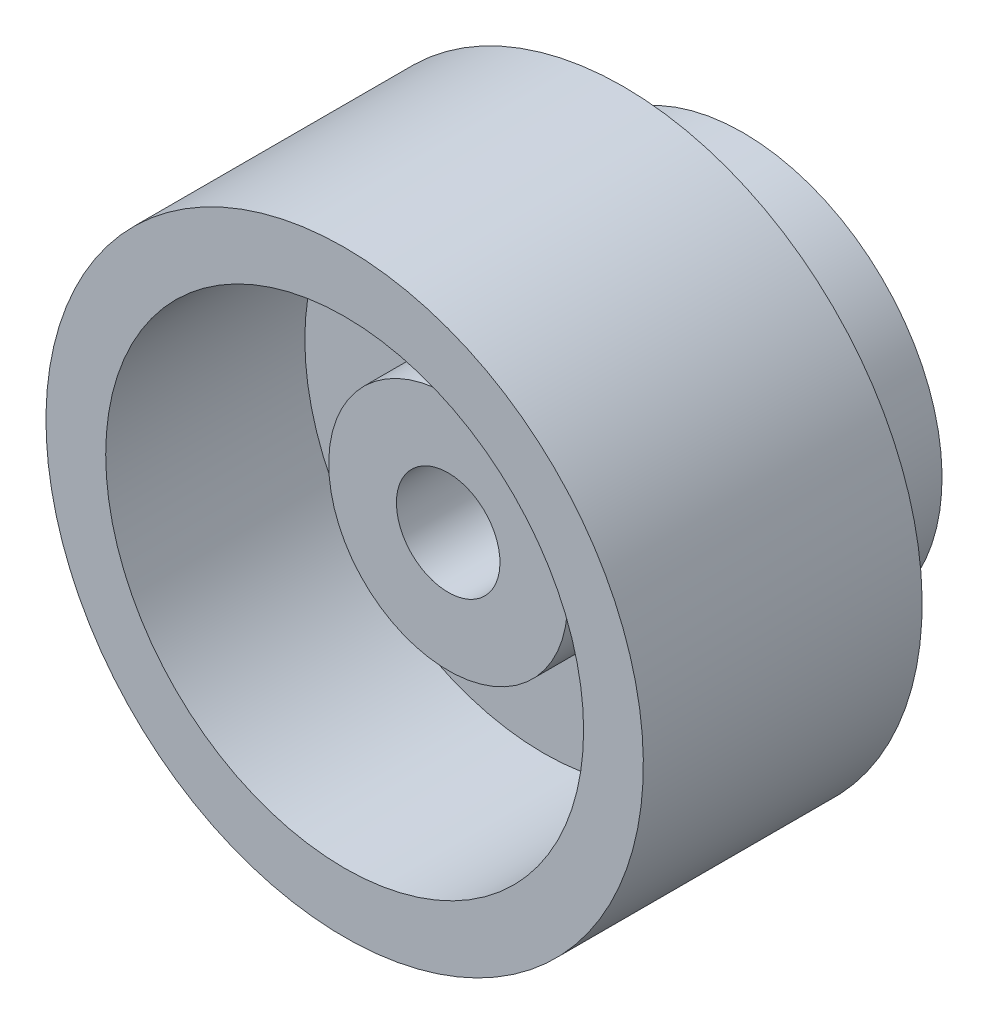
ISO-10303-21;
HEADER;
FILE_DESCRIPTION(('STEP AP214'),'2;1');
FILE_NAME('part.step','',(''),(''),'','','');
FILE_SCHEMA(('AUTOMOTIVE_DESIGN { 1 0 10303 214 1 1 1 1 }'));
ENDSEC;
DATA;
#1=APPLICATION_CONTEXT('core data for automotive mechanical design processes');
#2=APPLICATION_PROTOCOL_DEFINITION('international standard','automotive_design',2000,#1);
#3=PRODUCT_CONTEXT('',#1,'mechanical');
#4=PRODUCT('Part','Part','',(#3));
#5=PRODUCT_RELATED_PRODUCT_CATEGORY('part','',(#4));
#6=PRODUCT_DEFINITION_FORMATION('','',#4);
#7=PRODUCT_DEFINITION_CONTEXT('part definition',#1,'design');
#8=PRODUCT_DEFINITION('design','',#6,#7);
#9=PRODUCT_DEFINITION_SHAPE('','',#8);
#10=(LENGTH_UNIT() NAMED_UNIT(*) SI_UNIT(.MILLI.,.METRE.));
#11=(NAMED_UNIT(*) PLANE_ANGLE_UNIT() SI_UNIT($,.RADIAN.));
#12=(NAMED_UNIT(*) SI_UNIT($,.STERADIAN.) SOLID_ANGLE_UNIT());
#13=UNCERTAINTY_MEASURE_WITH_UNIT(LENGTH_MEASURE(1.E-05),#10,'distance_accuracy_value','');
#14=(GEOMETRIC_REPRESENTATION_CONTEXT(3) GLOBAL_UNCERTAINTY_ASSIGNED_CONTEXT((#13)) GLOBAL_UNIT_ASSIGNED_CONTEXT((#10,
#11,#12)) REPRESENTATION_CONTEXT('',''));
#15=CARTESIAN_POINT('',(0.,0.,0.));
#16=DIRECTION('',(0.,0.,1.));
#17=DIRECTION('',(1.,0.,0.));
#18=AXIS2_PLACEMENT_3D('',#15,#16,#17);
#19=CARTESIAN_POINT('',(0.,0.,-25.));
#20=DIRECTION('',(0.,0.,-1.));
#21=DIRECTION('',(0.,1.,0.));
#22=AXIS2_PLACEMENT_3D('',#19,#20,#21);
#23=CYLINDRICAL_SURFACE('',#22,6.49999999999999);
#24=CARTESIAN_POINT('',(0.,0.,-25.));
#25=DIRECTION('',(0.,0.,-1.));
#26=DIRECTION('',(0.,1.,0.));
#27=AXIS2_PLACEMENT_3D('',#24,#25,#26);
#28=CIRCLE('',#27,6.49999999999999);
#29=CARTESIAN_POINT('',(0.,6.5,-25.));
#30=VERTEX_POINT('',#29);
#31=EDGE_CURVE('E65',#30,#30,#28,.T.);
#32=ORIENTED_EDGE('',*,*,#31,.T.);
#33=EDGE_LOOP('',(#32));
#34=FACE_BOUND('',#33,.T.);
#35=CARTESIAN_POINT('',(0.,0.,12.));
#36=DIRECTION('',(0.,0.,-1.));
#37=DIRECTION('',(0.,1.,0.));
#38=AXIS2_PLACEMENT_3D('',#35,#36,#37);
#39=CIRCLE('',#38,6.5);
#40=CARTESIAN_POINT('',(0.,6.5,12.));
#41=VERTEX_POINT('',#40);
#42=EDGE_CURVE('E10',#41,#41,#39,.T.);
#43=ORIENTED_EDGE('',*,*,#42,.F.);
#44=EDGE_LOOP('',(#43));
#45=FACE_BOUND('',#44,.T.);
#46=ADVANCED_FACE('F31',(#34,#45),#23,.F.);
#47=CARTESIAN_POINT('',(0.,6.5,12.));
#48=DIRECTION('',(0.,0.,1.));
#49=DIRECTION('',(0.,-1.,0.));
#50=AXIS2_PLACEMENT_3D('',#47,#48,#49);
#51=PLANE('',#50);
#52=ORIENTED_EDGE('',*,*,#42,.T.);
#53=EDGE_LOOP('',(#52));
#54=FACE_BOUND('',#53,.T.);
#55=CARTESIAN_POINT('',(0.,0.,12.));
#56=DIRECTION('',(0.,0.,-1.));
#57=DIRECTION('',(0.,1.,0.));
#58=AXIS2_PLACEMENT_3D('',#55,#56,#57);
#59=CIRCLE('',#58,15.);
#60=CARTESIAN_POINT('',(0.,15.,12.));
#61=VERTEX_POINT('',#60);
#62=EDGE_CURVE('E37',#61,#61,#59,.T.);
#63=ORIENTED_EDGE('',*,*,#62,.F.);
#64=EDGE_LOOP('',(#63));
#65=FACE_BOUND('',#64,.T.);
#66=ADVANCED_FACE('F83',(#54,#65),#51,.T.);
#67=CARTESIAN_POINT('',(0.,0.,-25.));
#68=DIRECTION('',(0.,0.,-1.));
#69=DIRECTION('',(0.,1.,0.));
#70=AXIS2_PLACEMENT_3D('',#67,#68,#69);
#71=CYLINDRICAL_SURFACE('',#70,15.);
#72=ORIENTED_EDGE('',*,*,#62,.T.);
#73=EDGE_LOOP('',(#72));
#74=FACE_BOUND('',#73,.T.);
#75=CARTESIAN_POINT('',(0.,0.,0.));
#76=DIRECTION('',(0.,0.,-1.));
#77=DIRECTION('',(0.,1.,0.));
#78=AXIS2_PLACEMENT_3D('',#75,#76,#77);
#79=CIRCLE('',#78,15.);
#80=CARTESIAN_POINT('',(0.,15.,0.));
#81=VERTEX_POINT('',#80);
#82=EDGE_CURVE('E41',#81,#81,#79,.T.);
#83=ORIENTED_EDGE('',*,*,#82,.F.);
#84=EDGE_LOOP('',(#83));
#85=FACE_BOUND('',#84,.T.);
#86=ADVANCED_FACE('F87',(#74,#85),#71,.T.);
#87=CARTESIAN_POINT('',(0.,15.,0.));
#88=DIRECTION('',(0.,0.,1.));
#89=DIRECTION('',(0.,-1.,0.));
#90=AXIS2_PLACEMENT_3D('',#87,#88,#89);
#91=PLANE('',#90);
#92=ORIENTED_EDGE('',*,*,#82,.T.);
#93=EDGE_LOOP('',(#92));
#94=FACE_BOUND('',#93,.T.);
#95=CARTESIAN_POINT('',(0.,0.,0.));
#96=DIRECTION('',(0.,0.,-1.));
#97=DIRECTION('',(0.,1.,0.));
#98=AXIS2_PLACEMENT_3D('',#95,#96,#97);
#99=CIRCLE('',#98,30.);
#100=CARTESIAN_POINT('',(0.,30.,0.));
#101=VERTEX_POINT('',#100);
#102=EDGE_CURVE('E45',#101,#101,#99,.T.);
#103=ORIENTED_EDGE('',*,*,#102,.F.);
#104=EDGE_LOOP('',(#103));
#105=FACE_BOUND('',#104,.T.);
#106=ADVANCED_FACE('F91',(#94,#105),#91,.T.);
#107=CARTESIAN_POINT('',(0.,0.,-25.));
#108=DIRECTION('',(0.,0.,-1.));
#109=DIRECTION('',(0.,1.,0.));
#110=AXIS2_PLACEMENT_3D('',#107,#108,#109);
#111=CYLINDRICAL_SURFACE('',#110,30.);
#112=ORIENTED_EDGE('',*,*,#102,.T.);
#113=EDGE_LOOP('',(#112));
#114=FACE_BOUND('',#113,.T.);
#115=CARTESIAN_POINT('',(0.,0.,25.));
#116=DIRECTION('',(0.,0.,-1.));
#117=DIRECTION('',(0.,1.,0.));
#118=AXIS2_PLACEMENT_3D('',#115,#116,#117);
#119=CIRCLE('',#118,30.);
#120=CARTESIAN_POINT('',(0.,30.,25.));
#121=VERTEX_POINT('',#120);
#122=EDGE_CURVE('E50',#121,#121,#119,.T.);
#123=ORIENTED_EDGE('',*,*,#122,.F.);
#124=EDGE_LOOP('',(#123));
#125=FACE_BOUND('',#124,.T.);
#126=ADVANCED_FACE('F97',(#114,#125),#111,.F.);
#127=CARTESIAN_POINT('',(0.,30.,25.));
#128=DIRECTION('',(0.,0.,1.));
#129=DIRECTION('',(0.,-1.,0.));
#130=AXIS2_PLACEMENT_3D('',#127,#128,#129);
#131=PLANE('',#130);
#132=ORIENTED_EDGE('',*,*,#122,.T.);
#133=EDGE_LOOP('',(#132));
#134=FACE_BOUND('',#133,.T.);
#135=CARTESIAN_POINT('',(0.,0.,25.));
#136=DIRECTION('',(0.,0.,-1.));
#137=DIRECTION('',(0.,1.,0.));
#138=AXIS2_PLACEMENT_3D('',#135,#136,#137);
#139=CIRCLE('',#138,37.5);
#140=CARTESIAN_POINT('',(0.,37.5,25.));
#141=VERTEX_POINT('',#140);
#142=EDGE_CURVE('E53',#141,#141,#139,.T.);
#143=ORIENTED_EDGE('',*,*,#142,.F.);
#144=EDGE_LOOP('',(#143));
#145=FACE_BOUND('',#144,.T.);
#146=ADVANCED_FACE('F101',(#134,#145),#131,.T.);
#147=CARTESIAN_POINT('',(0.,0.,-25.));
#148=DIRECTION('',(0.,0.,-1.));
#149=DIRECTION('',(0.,1.,0.));
#150=AXIS2_PLACEMENT_3D('',#147,#148,#149);
#151=CYLINDRICAL_SURFACE('',#150,37.5);
#152=ORIENTED_EDGE('',*,*,#142,.T.);
#153=EDGE_LOOP('',(#152));
#154=FACE_BOUND('',#153,.T.);
#155=CARTESIAN_POINT('',(0.,0.,-10.));
#156=DIRECTION('',(0.,0.,-1.));
#157=DIRECTION('',(0.,1.,0.));
#158=AXIS2_PLACEMENT_3D('',#155,#156,#157);
#159=CIRCLE('',#158,37.5);
#160=CARTESIAN_POINT('',(0.,37.5,-10.));
#161=VERTEX_POINT('',#160);
#162=EDGE_CURVE('E56',#161,#161,#159,.T.);
#163=ORIENTED_EDGE('',*,*,#162,.F.);
#164=EDGE_LOOP('',(#163));
#165=FACE_BOUND('',#164,.T.);
#166=ADVANCED_FACE('F105',(#154,#165),#151,.T.);
#167=CARTESIAN_POINT('',(0.,37.5,-10.));
#168=DIRECTION('',(0.,0.,-1.));
#169=DIRECTION('',(0.,1.,0.));
#170=AXIS2_PLACEMENT_3D('',#167,#168,#169);
#171=PLANE('',#170);
#172=ORIENTED_EDGE('',*,*,#162,.T.);
#173=EDGE_LOOP('',(#172));
#174=FACE_BOUND('',#173,.T.);
#175=CARTESIAN_POINT('',(0.,0.,-10.));
#176=DIRECTION('',(0.,0.,-1.));
#177=DIRECTION('',(0.,1.,0.));
#178=AXIS2_PLACEMENT_3D('',#175,#176,#177);
#179=CIRCLE('',#178,25.);
#180=CARTESIAN_POINT('',(0.,25.,-10.));
#181=VERTEX_POINT('',#180);
#182=EDGE_CURVE('E59',#181,#181,#179,.T.);
#183=ORIENTED_EDGE('',*,*,#182,.F.);
#184=EDGE_LOOP('',(#183));
#185=FACE_BOUND('',#184,.T.);
#186=ADVANCED_FACE('F79',(#174,#185),#171,.T.);
#187=CARTESIAN_POINT('',(0.,0.,-25.));
#188=DIRECTION('',(0.,0.,-1.));
#189=DIRECTION('',(0.,1.,0.));
#190=AXIS2_PLACEMENT_3D('',#187,#188,#189);
#191=CYLINDRICAL_SURFACE('',#190,25.);
#192=ORIENTED_EDGE('',*,*,#182,.T.);
#193=EDGE_LOOP('',(#192));
#194=FACE_BOUND('',#193,.T.);
#195=CARTESIAN_POINT('',(0.,0.,-25.));
#196=DIRECTION('',(0.,0.,-1.));
#197=DIRECTION('',(0.,1.,0.));
#198=AXIS2_PLACEMENT_3D('',#195,#196,#197);
#199=CIRCLE('',#198,25.);
#200=CARTESIAN_POINT('',(0.,25.,-25.));
#201=VERTEX_POINT('',#200);
#202=EDGE_CURVE('E62',#201,#201,#199,.T.);
#203=ORIENTED_EDGE('',*,*,#202,.F.);
#204=EDGE_LOOP('',(#203));
#205=FACE_BOUND('',#204,.T.);
#206=ADVANCED_FACE('F73',(#194,#205),#191,.T.);
#207=CARTESIAN_POINT('',(0.,25.,-25.));
#208=DIRECTION('',(0.,0.,-1.));
#209=DIRECTION('',(0.,1.,0.));
#210=AXIS2_PLACEMENT_3D('',#207,#208,#209);
#211=PLANE('',#210);
#212=ORIENTED_EDGE('',*,*,#202,.T.);
#213=EDGE_LOOP('',(#212));
#214=FACE_BOUND('',#213,.T.);
#215=ORIENTED_EDGE('',*,*,#31,.F.);
#216=EDGE_LOOP('',(#215));
#217=FACE_BOUND('',#216,.T.);
#218=ADVANCED_FACE('F71',(#214,#217),#211,.T.);
#219=CLOSED_SHELL('',(#46,#66,#86,#106,#126,#146,#166,#186,#206,#218));
#220=MANIFOLD_SOLID_BREP('B2',#219);
#221=ADVANCED_BREP_SHAPE_REPRESENTATION('',(#18,#220),#14);
#222=SHAPE_DEFINITION_REPRESENTATION(#9,#221);
ENDSEC;
END-ISO-10303-21;
